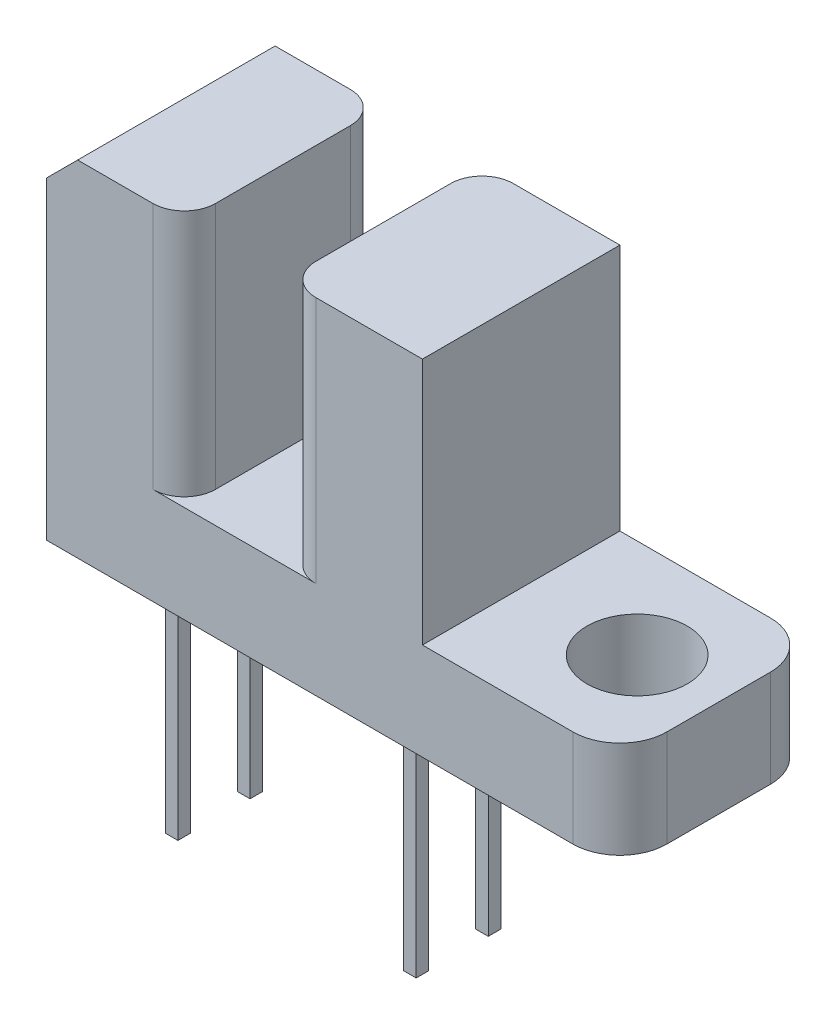
ISO-10303-21;
HEADER;
FILE_DESCRIPTION(('STEP AP214'),'2;1');
FILE_NAME('part.step','',(''),(''),'','','');
FILE_SCHEMA(('AUTOMOTIVE_DESIGN { 1 0 10303 214 1 1 1 1 }'));
ENDSEC;
DATA;
#1=APPLICATION_CONTEXT('core data for automotive mechanical design processes');
#2=APPLICATION_PROTOCOL_DEFINITION('international standard','automotive_design',2000,#1);
#3=PRODUCT_CONTEXT('',#1,'mechanical');
#4=PRODUCT('Part','Part','',(#3));
#5=PRODUCT_RELATED_PRODUCT_CATEGORY('part','',(#4));
#6=PRODUCT_DEFINITION_FORMATION('','',#4);
#7=PRODUCT_DEFINITION_CONTEXT('part definition',#1,'design');
#8=PRODUCT_DEFINITION('design','',#6,#7);
#9=PRODUCT_DEFINITION_SHAPE('','',#8);
#10=(LENGTH_UNIT() NAMED_UNIT(*) SI_UNIT(.MILLI.,.METRE.));
#11=(NAMED_UNIT(*) PLANE_ANGLE_UNIT() SI_UNIT($,.RADIAN.));
#12=(NAMED_UNIT(*) SI_UNIT($,.STERADIAN.) SOLID_ANGLE_UNIT());
#13=UNCERTAINTY_MEASURE_WITH_UNIT(LENGTH_MEASURE(1.E-05),#10,'distance_accuracy_value','');
#14=(GEOMETRIC_REPRESENTATION_CONTEXT(3) GLOBAL_UNCERTAINTY_ASSIGNED_CONTEXT((#13)) GLOBAL_UNIT_ASSIGNED_CONTEXT((#10,
#11,#12)) REPRESENTATION_CONTEXT('',''));
#15=CARTESIAN_POINT('',(0.,0.,0.));
#16=DIRECTION('',(0.,0.,1.));
#17=DIRECTION('',(1.,0.,0.));
#18=AXIS2_PLACEMENT_3D('',#15,#16,#17);
#19=CARTESIAN_POINT('',(0.,0.,0.));
#20=DIRECTION('',(0.,1.,0.));
#21=DIRECTION('',(0.,0.,1.));
#22=AXIS2_PLACEMENT_3D('',#19,#20,#21);
#23=PLANE('',#22);
#24=DIRECTION('',(0.,0.,1.));
#25=VECTOR('',#24,1.);
#26=CARTESIAN_POINT('',(-6.75,0.,1.35));
#27=LINE('',#26,#25);
#28=CARTESIAN_POINT('',(-6.75,0.,0.95));
#29=VERTEX_POINT('',#28);
#30=CARTESIAN_POINT('',(-6.75,0.,1.35));
#31=VERTEX_POINT('',#30);
#32=EDGE_CURVE('E279',#29,#31,#27,.T.);
#33=ORIENTED_EDGE('',*,*,#32,.F.);
#34=DIRECTION('',(1.,0.,0.));
#35=VECTOR('',#34,1.);
#36=CARTESIAN_POINT('',(-7.15,0.,0.95));
#37=LINE('',#36,#35);
#38=CARTESIAN_POINT('',(-7.15,0.,0.95));
#39=VERTEX_POINT('',#38);
#40=EDGE_CURVE('E295',#39,#29,#37,.T.);
#41=ORIENTED_EDGE('',*,*,#40,.F.);
#42=DIRECTION('',(0.,0.,-1.));
#43=VECTOR('',#42,1.);
#44=CARTESIAN_POINT('',(-7.15,0.,1.35));
#45=LINE('',#44,#43);
#46=CARTESIAN_POINT('',(-7.15,0.,1.35));
#47=VERTEX_POINT('',#46);
#48=EDGE_CURVE('E308',#47,#39,#45,.T.);
#49=ORIENTED_EDGE('',*,*,#48,.F.);
#50=DIRECTION('',(-1.,0.,0.));
#51=VECTOR('',#50,1.);
#52=CARTESIAN_POINT('',(-7.15,0.,1.35));
#53=LINE('',#52,#51);
#54=EDGE_CURVE('E284',#31,#47,#53,.T.);
#55=ORIENTED_EDGE('',*,*,#54,.F.);
#56=EDGE_LOOP('',(#33,#41,#49,#55));
#57=FACE_BOUND('',#56,.T.);
#58=DIRECTION('',(0.,0.,1.));
#59=VECTOR('',#58,1.);
#60=CARTESIAN_POINT('',(0.85,0.,1.35));
#61=LINE('',#60,#59);
#62=CARTESIAN_POINT('',(0.85,0.,0.95));
#63=VERTEX_POINT('',#62);
#64=CARTESIAN_POINT('',(0.85,0.,1.35));
#65=VERTEX_POINT('',#64);
#66=EDGE_CURVE('E375',#63,#65,#61,.T.);
#67=ORIENTED_EDGE('',*,*,#66,.F.);
#68=DIRECTION('',(1.,0.,0.));
#69=VECTOR('',#68,1.);
#70=CARTESIAN_POINT('',(0.450000000000001,0.,0.95));
#71=LINE('',#70,#69);
#72=CARTESIAN_POINT('',(0.450000000000001,0.,0.95));
#73=VERTEX_POINT('',#72);
#74=EDGE_CURVE('E381',#73,#63,#71,.T.);
#75=ORIENTED_EDGE('',*,*,#74,.F.);
#76=DIRECTION('',(0.,0.,-1.));
#77=VECTOR('',#76,1.);
#78=CARTESIAN_POINT('',(0.45,0.,1.35));
#79=LINE('',#78,#77);
#80=CARTESIAN_POINT('',(0.45,0.,1.35));
#81=VERTEX_POINT('',#80);
#82=EDGE_CURVE('E398',#81,#73,#79,.T.);
#83=ORIENTED_EDGE('',*,*,#82,.F.);
#84=DIRECTION('',(-1.,0.,0.));
#85=VECTOR('',#84,1.);
#86=CARTESIAN_POINT('',(0.45,0.,1.35));
#87=LINE('',#86,#85);
#88=EDGE_CURVE('E394',#65,#81,#87,.T.);
#89=ORIENTED_EDGE('',*,*,#88,.F.);
#90=EDGE_LOOP('',(#67,#75,#83,#89));
#91=FACE_BOUND('',#90,.T.);
#92=CARTESIAN_POINT('',(6.55,0.,0.));
#93=DIRECTION('',(0.,1.,0.));
#94=DIRECTION('',(0.,0.,1.));
#95=AXIS2_PLACEMENT_3D('',#92,#93,#94);
#96=CIRCLE('',#95,1.6);
#97=CARTESIAN_POINT('',(6.55,0.,1.6));
#98=VERTEX_POINT('',#97);
#99=EDGE_CURVE('E446',#98,#98,#96,.T.);
#100=ORIENTED_EDGE('',*,*,#99,.T.);
#101=EDGE_LOOP('',(#100));
#102=FACE_BOUND('',#101,.T.);
#103=DIRECTION('',(-1.,0.,0.));
#104=VECTOR('',#103,1.);
#105=CARTESIAN_POINT('',(-9.15,0.,-3.15));
#106=LINE('',#105,#104);
#107=CARTESIAN_POINT('',(7.65,0.,-3.15));
#108=VERTEX_POINT('',#107);
#109=CARTESIAN_POINT('',(-9.15,0.,-3.15));
#110=VERTEX_POINT('',#109);
#111=EDGE_CURVE('E491',#108,#110,#106,.T.);
#112=ORIENTED_EDGE('',*,*,#111,.F.);
#113=CARTESIAN_POINT('',(7.65,0.,-1.65));
#114=DIRECTION('',(0.,1.,0.));
#115=DIRECTION('',(0.,0.,1.));
#116=AXIS2_PLACEMENT_3D('',#113,#114,#115);
#117=CIRCLE('',#116,1.5);
#118=CARTESIAN_POINT('',(9.15,0.,-1.65));
#119=VERTEX_POINT('',#118);
#120=EDGE_CURVE('E514',#108,#119,#117,.F.);
#121=ORIENTED_EDGE('',*,*,#120,.T.);
#122=DIRECTION('',(0.,0.,-1.));
#123=VECTOR('',#122,1.);
#124=CARTESIAN_POINT('',(9.15,0.,-3.15));
#125=LINE('',#124,#123);
#126=CARTESIAN_POINT('',(9.15,0.,1.65));
#127=VERTEX_POINT('',#126);
#128=EDGE_CURVE('E475',#127,#119,#125,.T.);
#129=ORIENTED_EDGE('',*,*,#128,.F.);
#130=CARTESIAN_POINT('',(7.65,0.,1.65));
#131=DIRECTION('',(0.,1.,0.));
#132=DIRECTION('',(0.,0.,1.));
#133=AXIS2_PLACEMENT_3D('',#130,#131,#132);
#134=CIRCLE('',#133,1.5);
#135=CARTESIAN_POINT('',(7.65,0.,3.15));
#136=VERTEX_POINT('',#135);
#137=EDGE_CURVE('E511',#127,#136,#134,.F.);
#138=ORIENTED_EDGE('',*,*,#137,.T.);
#139=DIRECTION('',(1.,0.,0.));
#140=VECTOR('',#139,1.);
#141=CARTESIAN_POINT('',(-9.15,0.,3.15));
#142=LINE('',#141,#140);
#143=CARTESIAN_POINT('',(-9.15,0.,3.15));
#144=VERTEX_POINT('',#143);
#145=EDGE_CURVE('E481',#144,#136,#142,.T.);
#146=ORIENTED_EDGE('',*,*,#145,.F.);
#147=DIRECTION('',(0.,0.,1.));
#148=VECTOR('',#147,1.);
#149=CARTESIAN_POINT('',(-9.15,0.,-3.15));
#150=LINE('',#149,#148);
#151=EDGE_CURVE('E495',#110,#144,#150,.T.);
#152=ORIENTED_EDGE('',*,*,#151,.F.);
#153=EDGE_LOOP('',(#112,#121,#129,#138,#146,#152));
#154=FACE_BOUND('',#153,.T.);
#155=DIRECTION('',(0.,0.,1.));
#156=VECTOR('',#155,1.);
#157=CARTESIAN_POINT('',(0.85,0.,-0.95));
#158=LINE('',#157,#156);
#159=CARTESIAN_POINT('',(0.85,0.,-1.35));
#160=VERTEX_POINT('',#159);
#161=CARTESIAN_POINT('',(0.85,0.,-0.95));
#162=VERTEX_POINT('',#161);
#163=EDGE_CURVE('E330',#160,#162,#158,.T.);
#164=ORIENTED_EDGE('',*,*,#163,.F.);
#165=DIRECTION('',(1.,0.,0.));
#166=VECTOR('',#165,1.);
#167=CARTESIAN_POINT('',(0.45,0.,-1.35));
#168=LINE('',#167,#166);
#169=CARTESIAN_POINT('',(0.45,0.,-1.35));
#170=VERTEX_POINT('',#169);
#171=EDGE_CURVE('E336',#170,#160,#168,.T.);
#172=ORIENTED_EDGE('',*,*,#171,.F.);
#173=DIRECTION('',(0.,0.,-1.));
#174=VECTOR('',#173,1.);
#175=CARTESIAN_POINT('',(0.45,0.,-0.95));
#176=LINE('',#175,#174);
#177=CARTESIAN_POINT('',(0.45,0.,-0.95));
#178=VERTEX_POINT('',#177);
#179=EDGE_CURVE('E353',#178,#170,#176,.T.);
#180=ORIENTED_EDGE('',*,*,#179,.F.);
#181=DIRECTION('',(-1.,0.,0.));
#182=VECTOR('',#181,1.);
#183=CARTESIAN_POINT('',(0.45,0.,-0.95));
#184=LINE('',#183,#182);
#185=EDGE_CURVE('E349',#162,#178,#184,.T.);
#186=ORIENTED_EDGE('',*,*,#185,.F.);
#187=EDGE_LOOP('',(#164,#172,#180,#186));
#188=FACE_BOUND('',#187,.T.);
#189=DIRECTION('',(0.,0.,1.));
#190=VECTOR('',#189,1.);
#191=CARTESIAN_POINT('',(-6.75,0.,-0.95));
#192=LINE('',#191,#190);
#193=CARTESIAN_POINT('',(-6.75,0.,-1.35));
#194=VERTEX_POINT('',#193);
#195=CARTESIAN_POINT('',(-6.75,0.,-0.95));
#196=VERTEX_POINT('',#195);
#197=EDGE_CURVE('E277',#194,#196,#192,.T.);
#198=ORIENTED_EDGE('',*,*,#197,.F.);
#199=DIRECTION('',(1.,0.,0.));
#200=VECTOR('',#199,1.);
#201=CARTESIAN_POINT('',(-7.15,0.,-1.35));
#202=LINE('',#201,#200);
#203=CARTESIAN_POINT('',(-7.15,0.,-1.35));
#204=VERTEX_POINT('',#203);
#205=EDGE_CURVE('E274',#204,#194,#202,.T.);
#206=ORIENTED_EDGE('',*,*,#205,.F.);
#207=DIRECTION('',(0.,0.,-1.));
#208=VECTOR('',#207,1.);
#209=CARTESIAN_POINT('',(-7.15,0.,-0.95));
#210=LINE('',#209,#208);
#211=CARTESIAN_POINT('',(-7.15,0.,-0.95));
#212=VERTEX_POINT('',#211);
#213=EDGE_CURVE('E61',#212,#204,#210,.T.);
#214=ORIENTED_EDGE('',*,*,#213,.F.);
#215=DIRECTION('',(-1.,0.,0.));
#216=VECTOR('',#215,1.);
#217=CARTESIAN_POINT('',(-7.15,0.,-0.95));
#218=LINE('',#217,#216);
#219=EDGE_CURVE('E56',#196,#212,#218,.T.);
#220=ORIENTED_EDGE('',*,*,#219,.F.);
#221=EDGE_LOOP('',(#198,#206,#214,#220));
#222=FACE_BOUND('',#221,.T.);
#223=ADVANCED_FACE('F40',(#57,#91,#102,#154,#188,#222),#23,.F.);
#224=CARTESIAN_POINT('',(0.,11.,0.));
#225=DIRECTION('',(0.,-1.,0.));
#226=DIRECTION('',(0.,0.,-1.));
#227=AXIS2_PLACEMENT_3D('',#224,#225,#226);
#228=PLANE('',#227);
#229=DIRECTION('',(1.,0.,0.));
#230=VECTOR('',#229,1.);
#231=CARTESIAN_POINT('',(-9.15,11.,3.15));
#232=LINE('',#231,#230);
#233=CARTESIAN_POINT('',(-8.15,11.,3.15));
#234=VERTEX_POINT('',#233);
#235=CARTESIAN_POINT('',(-5.75,11.,3.15));
#236=VERTEX_POINT('',#235);
#237=EDGE_CURVE('E451',#234,#236,#232,.T.);
#238=ORIENTED_EDGE('',*,*,#237,.T.);
#239=CARTESIAN_POINT('',(-5.75,11.,2.15));
#240=DIRECTION('',(0.,-1.,0.));
#241=DIRECTION('',(0.,0.,-1.));
#242=AXIS2_PLACEMENT_3D('',#239,#240,#241);
#243=CIRCLE('',#242,1.);
#244=CARTESIAN_POINT('',(-4.75,11.,2.15));
#245=VERTEX_POINT('',#244);
#246=EDGE_CURVE('E586',#236,#245,#243,.F.);
#247=ORIENTED_EDGE('',*,*,#246,.T.);
#248=DIRECTION('',(0.,0.,1.));
#249=VECTOR('',#248,1.);
#250=CARTESIAN_POINT('',(-4.75,11.,-3.15));
#251=LINE('',#250,#249);
#252=CARTESIAN_POINT('',(-4.75,11.,-2.15));
#253=VERTEX_POINT('',#252);
#254=EDGE_CURVE('E427',#253,#245,#251,.T.);
#255=ORIENTED_EDGE('',*,*,#254,.F.);
#256=CARTESIAN_POINT('',(-5.75,11.,-2.15));
#257=DIRECTION('',(0.,-1.,0.));
#258=DIRECTION('',(0.,0.,-1.));
#259=AXIS2_PLACEMENT_3D('',#256,#257,#258);
#260=CIRCLE('',#259,1.);
#261=CARTESIAN_POINT('',(-5.75,11.,-3.15));
#262=VERTEX_POINT('',#261);
#263=EDGE_CURVE('E583',#253,#262,#260,.F.);
#264=ORIENTED_EDGE('',*,*,#263,.T.);
#265=DIRECTION('',(-1.,0.,0.));
#266=VECTOR('',#265,1.);
#267=CARTESIAN_POINT('',(-9.15,11.,-3.15));
#268=LINE('',#267,#266);
#269=CARTESIAN_POINT('',(-8.15,11.,-3.15));
#270=VERTEX_POINT('',#269);
#271=EDGE_CURVE('E459',#262,#270,#268,.T.);
#272=ORIENTED_EDGE('',*,*,#271,.T.);
#273=DIRECTION('',(0.,0.,1.));
#274=VECTOR('',#273,1.);
#275=CARTESIAN_POINT('',(-8.15,11.,0.));
#276=LINE('',#275,#274);
#277=EDGE_CURVE('E534',#270,#234,#276,.T.);
#278=ORIENTED_EDGE('',*,*,#277,.T.);
#279=EDGE_LOOP('',(#238,#247,#255,#264,#272,#278));
#280=FACE_BOUND('',#279,.T.);
#281=ADVANCED_FACE('F610',(#280),#228,.F.);
#282=CARTESIAN_POINT('',(9.15,3.1,-3.15));
#283=DIRECTION('',(-1.,0.,0.));
#284=DIRECTION('',(0.,0.,1.));
#285=AXIS2_PLACEMENT_3D('',#282,#283,#284);
#286=PLANE('',#285);
#287=ORIENTED_EDGE('',*,*,#128,.T.);
#288=DIRECTION('',(0.,-1.,0.));
#289=VECTOR('',#288,1.);
#290=CARTESIAN_POINT('',(9.15,3.1,-1.65));
#291=LINE('',#290,#289);
#292=CARTESIAN_POINT('',(9.15,3.1,-1.65));
#293=VERTEX_POINT('',#292);
#294=EDGE_CURVE('E521',#119,#293,#291,.F.);
#295=ORIENTED_EDGE('',*,*,#294,.T.);
#296=DIRECTION('',(0.,0.,-1.));
#297=VECTOR('',#296,1.);
#298=CARTESIAN_POINT('',(9.15,3.1,-3.15));
#299=LINE('',#298,#297);
#300=CARTESIAN_POINT('',(9.15,3.1,1.65));
#301=VERTEX_POINT('',#300);
#302=EDGE_CURVE('E476',#301,#293,#299,.T.);
#303=ORIENTED_EDGE('',*,*,#302,.F.);
#304=DIRECTION('',(0.,-1.,0.));
#305=VECTOR('',#304,1.);
#306=CARTESIAN_POINT('',(9.15,3.1,1.65));
#307=LINE('',#306,#305);
#308=EDGE_CURVE('E517',#301,#127,#307,.T.);
#309=ORIENTED_EDGE('',*,*,#308,.T.);
#310=EDGE_LOOP('',(#287,#295,#303,#309));
#311=FACE_BOUND('',#310,.T.);
#312=ADVANCED_FACE('F639',(#311),#286,.F.);
#313=CARTESIAN_POINT('',(-9.15,3.1,-3.15));
#314=DIRECTION('',(0.,0.,1.));
#315=DIRECTION('',(1.,0.,0.));
#316=AXIS2_PLACEMENT_3D('',#313,#314,#315);
#317=PLANE('',#316);
#318=DIRECTION('',(1.,0.,0.));
#319=VECTOR('',#318,1.);
#320=CARTESIAN_POINT('',(-4.75,3.1,-3.15));
#321=LINE('',#320,#319);
#322=CARTESIAN_POINT('',(-5.75,3.1,-3.15));
#323=VERTEX_POINT('',#322);
#324=CARTESIAN_POINT('',(-0.55,3.1,-3.15));
#325=VERTEX_POINT('',#324);
#326=EDGE_CURVE('E421',#323,#325,#321,.T.);
#327=ORIENTED_EDGE('',*,*,#326,.T.);
#328=DIRECTION('',(0.,1.,0.));
#329=VECTOR('',#328,1.);
#330=CARTESIAN_POINT('',(-0.549999999999998,3.1,-3.15));
#331=LINE('',#330,#329);
#332=CARTESIAN_POINT('',(-0.550000000000002,11.,-3.15));
#333=VERTEX_POINT('',#332);
#334=EDGE_CURVE('E552',#325,#333,#331,.T.);
#335=ORIENTED_EDGE('',*,*,#334,.T.);
#336=CARTESIAN_POINT('',(2.85,11.,-3.15));
#337=VERTEX_POINT('',#336);
#338=EDGE_CURVE('E460',#337,#333,#268,.T.);
#339=ORIENTED_EDGE('',*,*,#338,.F.);
#340=DIRECTION('',(0.,-1.,0.));
#341=VECTOR('',#340,1.);
#342=CARTESIAN_POINT('',(2.85,11.,-3.15));
#343=LINE('',#342,#341);
#344=CARTESIAN_POINT('',(2.85,3.1,-3.15));
#345=VERTEX_POINT('',#344);
#346=EDGE_CURVE('E464',#337,#345,#343,.T.);
#347=ORIENTED_EDGE('',*,*,#346,.T.);
#348=DIRECTION('',(-1.,0.,0.));
#349=VECTOR('',#348,1.);
#350=CARTESIAN_POINT('',(-9.15,3.1,-3.15));
#351=LINE('',#350,#349);
#352=CARTESIAN_POINT('',(7.65,3.1,-3.15));
#353=VERTEX_POINT('',#352);
#354=EDGE_CURVE('E480',#353,#345,#351,.T.);
#355=ORIENTED_EDGE('',*,*,#354,.F.);
#356=DIRECTION('',(0.,-1.,0.));
#357=VECTOR('',#356,1.);
#358=CARTESIAN_POINT('',(7.65,3.1,-3.15));
#359=LINE('',#358,#357);
#360=EDGE_CURVE('E507',#353,#108,#359,.T.);
#361=ORIENTED_EDGE('',*,*,#360,.T.);
#362=ORIENTED_EDGE('',*,*,#111,.T.);
#363=DIRECTION('',(0.,-1.,0.));
#364=VECTOR('',#363,1.);
#365=CARTESIAN_POINT('',(-9.15,3.1,-3.15));
#366=LINE('',#365,#364);
#367=CARTESIAN_POINT('',(-9.15,9.99999999999999,-3.15));
#368=VERTEX_POINT('',#367);
#369=EDGE_CURVE('E504',#368,#110,#366,.T.);
#370=ORIENTED_EDGE('',*,*,#369,.F.);
#371=DIRECTION('',(-0.707106781186547,-0.707106781186548,0.));
#372=VECTOR('',#371,1.);
#373=CARTESIAN_POINT('',(-8.15,11.,-3.15));
#374=LINE('',#373,#372);
#375=EDGE_CURVE('E544',#368,#270,#374,.F.);
#376=ORIENTED_EDGE('',*,*,#375,.T.);
#377=ORIENTED_EDGE('',*,*,#271,.F.);
#378=DIRECTION('',(0.,-1.,0.));
#379=VECTOR('',#378,1.);
#380=CARTESIAN_POINT('',(-5.75,3.1,-3.15));
#381=LINE('',#380,#379);
#382=EDGE_CURVE('E548',#262,#323,#381,.T.);
#383=ORIENTED_EDGE('',*,*,#382,.T.);
#384=EDGE_LOOP('',(#327,#335,#339,#347,#355,#361,#362,#370,#376,#377,#383));
#385=FACE_BOUND('',#384,.T.);
#386=ADVANCED_FACE('F646',(#385),#317,.F.);
#387=CARTESIAN_POINT('',(-9.15,3.1,-3.15));
#388=DIRECTION('',(1.,0.,0.));
#389=DIRECTION('',(0.,0.,-1.));
#390=AXIS2_PLACEMENT_3D('',#387,#388,#389);
#391=PLANE('',#390);
#392=DIRECTION('',(0.,-1.,0.));
#393=VECTOR('',#392,1.);
#394=CARTESIAN_POINT('',(-9.15,3.1,3.15));
#395=LINE('',#394,#393);
#396=CARTESIAN_POINT('',(-9.15,9.99999999999999,3.15));
#397=VERTEX_POINT('',#396);
#398=EDGE_CURVE('E487',#397,#144,#395,.T.);
#399=ORIENTED_EDGE('',*,*,#398,.F.);
#400=DIRECTION('',(0.,0.,-1.));
#401=VECTOR('',#400,1.);
#402=CARTESIAN_POINT('',(-9.15,10.,-3.15));
#403=LINE('',#402,#401);
#404=EDGE_CURVE('E541',#397,#368,#403,.T.);
#405=ORIENTED_EDGE('',*,*,#404,.T.);
#406=ORIENTED_EDGE('',*,*,#369,.T.);
#407=ORIENTED_EDGE('',*,*,#151,.T.);
#408=EDGE_LOOP('',(#399,#405,#406,#407));
#409=FACE_BOUND('',#408,.T.);
#410=ADVANCED_FACE('F620',(#409),#391,.F.);
#411=CARTESIAN_POINT('',(-9.15,3.1,3.15));
#412=DIRECTION('',(0.,0.,-1.));
#413=DIRECTION('',(-1.,0.,0.));
#414=AXIS2_PLACEMENT_3D('',#411,#412,#413);
#415=PLANE('',#414);
#416=CARTESIAN_POINT('',(-0.550000000000002,11.,3.15));
#417=VERTEX_POINT('',#416);
#418=CARTESIAN_POINT('',(2.85,11.,3.15));
#419=VERTEX_POINT('',#418);
#420=EDGE_CURVE('E456',#417,#419,#232,.T.);
#421=ORIENTED_EDGE('',*,*,#420,.F.);
#422=DIRECTION('',(0.,1.,0.));
#423=VECTOR('',#422,1.);
#424=CARTESIAN_POINT('',(-0.55,3.1,3.15));
#425=LINE('',#424,#423);
#426=CARTESIAN_POINT('',(-0.55,3.1,3.15));
#427=VERTEX_POINT('',#426);
#428=EDGE_CURVE('E572',#417,#427,#425,.F.);
#429=ORIENTED_EDGE('',*,*,#428,.T.);
#430=DIRECTION('',(1.,0.,0.));
#431=VECTOR('',#430,1.);
#432=CARTESIAN_POINT('',(-4.75,3.1,3.15));
#433=LINE('',#432,#431);
#434=CARTESIAN_POINT('',(-5.75,3.1,3.15));
#435=VERTEX_POINT('',#434);
#436=EDGE_CURVE('E420',#435,#427,#433,.T.);
#437=ORIENTED_EDGE('',*,*,#436,.F.);
#438=DIRECTION('',(0.,-1.,0.));
#439=VECTOR('',#438,1.);
#440=CARTESIAN_POINT('',(-5.75,3.1,3.15));
#441=LINE('',#440,#439);
#442=EDGE_CURVE('E569',#435,#236,#441,.F.);
#443=ORIENTED_EDGE('',*,*,#442,.T.);
#444=ORIENTED_EDGE('',*,*,#237,.F.);
#445=DIRECTION('',(0.707106781186547,0.707106781186548,0.));
#446=VECTOR('',#445,1.);
#447=CARTESIAN_POINT('',(-8.15,11.,3.15));
#448=LINE('',#447,#446);
#449=EDGE_CURVE('E538',#234,#397,#448,.F.);
#450=ORIENTED_EDGE('',*,*,#449,.T.);
#451=ORIENTED_EDGE('',*,*,#398,.T.);
#452=ORIENTED_EDGE('',*,*,#145,.T.);
#453=DIRECTION('',(0.,-1.,0.));
#454=VECTOR('',#453,1.);
#455=CARTESIAN_POINT('',(7.65,3.1,3.15));
#456=LINE('',#455,#454);
#457=CARTESIAN_POINT('',(7.65,3.1,3.15));
#458=VERTEX_POINT('',#457);
#459=EDGE_CURVE('E530',#136,#458,#456,.F.);
#460=ORIENTED_EDGE('',*,*,#459,.T.);
#461=DIRECTION('',(1.,0.,0.));
#462=VECTOR('',#461,1.);
#463=CARTESIAN_POINT('',(-9.15,3.1,3.15));
#464=LINE('',#463,#462);
#465=CARTESIAN_POINT('',(2.85,3.1,3.15));
#466=VERTEX_POINT('',#465);
#467=EDGE_CURVE('E484',#466,#458,#464,.T.);
#468=ORIENTED_EDGE('',*,*,#467,.F.);
#469=DIRECTION('',(0.,-1.,0.));
#470=VECTOR('',#469,1.);
#471=CARTESIAN_POINT('',(2.85,11.,3.15));
#472=LINE('',#471,#470);
#473=EDGE_CURVE('E471',#419,#466,#472,.T.);
#474=ORIENTED_EDGE('',*,*,#473,.F.);
#475=EDGE_LOOP('',(#421,#429,#437,#443,#444,#450,#451,#452,#460,#468,#474));
#476=FACE_BOUND('',#475,.T.);
#477=ADVANCED_FACE('F608',(#476),#415,.F.);
#478=CARTESIAN_POINT('',(0.,3.1,0.));
#479=DIRECTION('',(0.,1.,0.));
#480=DIRECTION('',(0.,0.,1.));
#481=AXIS2_PLACEMENT_3D('',#478,#479,#480);
#482=PLANE('',#481);
#483=CARTESIAN_POINT('',(6.55,3.1,0.));
#484=DIRECTION('',(0.,1.,0.));
#485=DIRECTION('',(0.,0.,1.));
#486=AXIS2_PLACEMENT_3D('',#483,#484,#485);
#487=CIRCLE('',#486,1.6);
#488=CARTESIAN_POINT('',(6.55,3.1,1.6));
#489=VERTEX_POINT('',#488);
#490=EDGE_CURVE('E431',#489,#489,#487,.T.);
#491=ORIENTED_EDGE('',*,*,#490,.F.);
#492=EDGE_LOOP('',(#491));
#493=FACE_BOUND('',#492,.T.);
#494=DIRECTION('',(0.,0.,-1.));
#495=VECTOR('',#494,1.);
#496=CARTESIAN_POINT('',(2.85,3.1,3.15));
#497=LINE('',#496,#495);
#498=EDGE_CURVE('E450',#466,#345,#497,.T.);
#499=ORIENTED_EDGE('',*,*,#498,.F.);
#500=ORIENTED_EDGE('',*,*,#467,.T.);
#501=CARTESIAN_POINT('',(7.65,3.1,1.65));
#502=DIRECTION('',(0.,1.,0.));
#503=DIRECTION('',(0.,0.,1.));
#504=AXIS2_PLACEMENT_3D('',#501,#502,#503);
#505=CIRCLE('',#504,1.5);
#506=EDGE_CURVE('E524',#458,#301,#505,.T.);
#507=ORIENTED_EDGE('',*,*,#506,.T.);
#508=ORIENTED_EDGE('',*,*,#302,.T.);
#509=CARTESIAN_POINT('',(7.65,3.1,-1.65));
#510=DIRECTION('',(0.,1.,0.));
#511=DIRECTION('',(0.,0.,1.));
#512=AXIS2_PLACEMENT_3D('',#509,#510,#511);
#513=CIRCLE('',#512,1.5);
#514=EDGE_CURVE('E527',#293,#353,#513,.T.);
#515=ORIENTED_EDGE('',*,*,#514,.T.);
#516=ORIENTED_EDGE('',*,*,#354,.T.);
#517=EDGE_LOOP('',(#499,#500,#507,#508,#515,#516));
#518=FACE_BOUND('',#517,.T.);
#519=ADVANCED_FACE('F636',(#493,#518),#482,.T.);
#520=CARTESIAN_POINT('',(7.65,3.1,-1.65));
#521=DIRECTION('',(0.,-1.,0.));
#522=DIRECTION('',(0.,0.,-1.));
#523=AXIS2_PLACEMENT_3D('',#520,#521,#522);
#524=CYLINDRICAL_SURFACE('',#523,1.5);
#525=ORIENTED_EDGE('',*,*,#514,.F.);
#526=ORIENTED_EDGE('',*,*,#294,.F.);
#527=ORIENTED_EDGE('',*,*,#120,.F.);
#528=ORIENTED_EDGE('',*,*,#360,.F.);
#529=EDGE_LOOP('',(#525,#526,#527,#528));
#530=FACE_BOUND('',#529,.T.);
#531=ADVANCED_FACE('F642',(#530),#524,.T.);
#532=CARTESIAN_POINT('',(7.65,3.1,1.65));
#533=DIRECTION('',(0.,-1.,0.));
#534=DIRECTION('',(0.,0.,-1.));
#535=AXIS2_PLACEMENT_3D('',#532,#533,#534);
#536=CYLINDRICAL_SURFACE('',#535,1.5);
#537=ORIENTED_EDGE('',*,*,#506,.F.);
#538=ORIENTED_EDGE('',*,*,#459,.F.);
#539=ORIENTED_EDGE('',*,*,#137,.F.);
#540=ORIENTED_EDGE('',*,*,#308,.F.);
#541=EDGE_LOOP('',(#537,#538,#539,#540));
#542=FACE_BOUND('',#541,.T.);
#543=ADVANCED_FACE('F632',(#542),#536,.T.);
#544=CARTESIAN_POINT('',(2.85,11.,3.15));
#545=DIRECTION('',(-1.,0.,0.));
#546=DIRECTION('',(0.,0.,1.));
#547=AXIS2_PLACEMENT_3D('',#544,#545,#546);
#548=PLANE('',#547);
#549=ORIENTED_EDGE('',*,*,#498,.T.);
#550=ORIENTED_EDGE('',*,*,#346,.F.);
#551=DIRECTION('',(0.,0.,-1.));
#552=VECTOR('',#551,1.);
#553=CARTESIAN_POINT('',(2.85,11.,3.15));
#554=LINE('',#553,#552);
#555=EDGE_CURVE('E455',#419,#337,#554,.T.);
#556=ORIENTED_EDGE('',*,*,#555,.F.);
#557=ORIENTED_EDGE('',*,*,#473,.T.);
#558=EDGE_LOOP('',(#549,#550,#556,#557));
#559=FACE_BOUND('',#558,.T.);
#560=ADVANCED_FACE('F651',(#559),#548,.F.);
#561=ORIENTED_EDGE('',*,*,#338,.T.);
#562=CARTESIAN_POINT('',(-0.550000000000001,11.,-2.15));
#563=DIRECTION('',(0.,-1.,0.));
#564=DIRECTION('',(0.,0.,-1.));
#565=AXIS2_PLACEMENT_3D('',#562,#563,#564);
#566=CIRCLE('',#565,1.);
#567=CARTESIAN_POINT('',(-1.55,11.,-2.15));
#568=VERTEX_POINT('',#567);
#569=EDGE_CURVE('E559',#333,#568,#566,.F.);
#570=ORIENTED_EDGE('',*,*,#569,.T.);
#571=DIRECTION('',(0.,0.,1.));
#572=VECTOR('',#571,1.);
#573=CARTESIAN_POINT('',(-1.55,11.,-3.15));
#574=LINE('',#573,#572);
#575=CARTESIAN_POINT('',(-1.55,11.,2.15));
#576=VERTEX_POINT('',#575);
#577=EDGE_CURVE('E432',#568,#576,#574,.T.);
#578=ORIENTED_EDGE('',*,*,#577,.T.);
#579=CARTESIAN_POINT('',(-0.550000000000001,11.,2.15));
#580=DIRECTION('',(0.,-1.,0.));
#581=DIRECTION('',(0.,0.,-1.));
#582=AXIS2_PLACEMENT_3D('',#579,#580,#581);
#583=CIRCLE('',#582,1.);
#584=EDGE_CURVE('E556',#576,#417,#583,.F.);
#585=ORIENTED_EDGE('',*,*,#584,.T.);
#586=ORIENTED_EDGE('',*,*,#420,.T.);
#587=ORIENTED_EDGE('',*,*,#555,.T.);
#588=EDGE_LOOP('',(#561,#570,#578,#585,#586,#587));
#589=FACE_BOUND('',#588,.T.);
#590=ADVANCED_FACE('F685',(#589),#228,.F.);
#591=CARTESIAN_POINT('',(6.55,3.1,0.));
#592=DIRECTION('',(0.,1.,0.));
#593=DIRECTION('',(0.,0.,1.));
#594=AXIS2_PLACEMENT_3D('',#591,#592,#593);
#595=CYLINDRICAL_SURFACE('',#594,1.6);
#596=ORIENTED_EDGE('',*,*,#99,.F.);
#597=EDGE_LOOP('',(#596));
#598=FACE_BOUND('',#597,.T.);
#599=ORIENTED_EDGE('',*,*,#490,.T.);
#600=EDGE_LOOP('',(#599));
#601=FACE_BOUND('',#600,.T.);
#602=ADVANCED_FACE('F678',(#598,#601),#595,.F.);
#603=CARTESIAN_POINT('',(-4.75,11.,-3.15));
#604=DIRECTION('',(-1.,0.,0.));
#605=DIRECTION('',(0.,-1.,0.));
#606=AXIS2_PLACEMENT_3D('',#603,#604,#605);
#607=PLANE('',#606);
#608=ORIENTED_EDGE('',*,*,#254,.T.);
#609=DIRECTION('',(0.,-1.,0.));
#610=VECTOR('',#609,1.);
#611=CARTESIAN_POINT('',(-4.75,11.,2.15));
#612=LINE('',#611,#610);
#613=CARTESIAN_POINT('',(-4.75,3.1,2.15));
#614=VERTEX_POINT('',#613);
#615=EDGE_CURVE('E579',#245,#614,#612,.T.);
#616=ORIENTED_EDGE('',*,*,#615,.T.);
#617=DIRECTION('',(0.,0.,1.));
#618=VECTOR('',#617,1.);
#619=CARTESIAN_POINT('',(-4.75,3.1,-3.15));
#620=LINE('',#619,#618);
#621=CARTESIAN_POINT('',(-4.75,3.1,-2.15));
#622=VERTEX_POINT('',#621);
#623=EDGE_CURVE('E424',#622,#614,#620,.T.);
#624=ORIENTED_EDGE('',*,*,#623,.F.);
#625=DIRECTION('',(0.,-1.,0.));
#626=VECTOR('',#625,1.);
#627=CARTESIAN_POINT('',(-4.75,11.,-2.15));
#628=LINE('',#627,#626);
#629=EDGE_CURVE('E576',#622,#253,#628,.F.);
#630=ORIENTED_EDGE('',*,*,#629,.T.);
#631=EDGE_LOOP('',(#608,#616,#624,#630));
#632=FACE_BOUND('',#631,.T.);
#633=ADVANCED_FACE('F676',(#632),#607,.F.);
#634=CARTESIAN_POINT('',(-1.55,11.,-3.15));
#635=DIRECTION('',(1.,0.,0.));
#636=DIRECTION('',(0.,1.,0.));
#637=AXIS2_PLACEMENT_3D('',#634,#635,#636);
#638=PLANE('',#637);
#639=ORIENTED_EDGE('',*,*,#577,.F.);
#640=DIRECTION('',(0.,1.,0.));
#641=VECTOR('',#640,1.);
#642=CARTESIAN_POINT('',(-1.55,11.,-2.15));
#643=LINE('',#642,#641);
#644=CARTESIAN_POINT('',(-1.55,3.1,-2.15));
#645=VERTEX_POINT('',#644);
#646=EDGE_CURVE('E566',#568,#645,#643,.F.);
#647=ORIENTED_EDGE('',*,*,#646,.T.);
#648=DIRECTION('',(0.,0.,1.));
#649=VECTOR('',#648,1.);
#650=CARTESIAN_POINT('',(-1.55,3.1,-3.15));
#651=LINE('',#650,#649);
#652=CARTESIAN_POINT('',(-1.55,3.1,2.15));
#653=VERTEX_POINT('',#652);
#654=EDGE_CURVE('E436',#645,#653,#651,.T.);
#655=ORIENTED_EDGE('',*,*,#654,.T.);
#656=DIRECTION('',(0.,1.,0.));
#657=VECTOR('',#656,1.);
#658=CARTESIAN_POINT('',(-1.55,11.,2.15));
#659=LINE('',#658,#657);
#660=EDGE_CURVE('E562',#653,#576,#659,.T.);
#661=ORIENTED_EDGE('',*,*,#660,.T.);
#662=EDGE_LOOP('',(#639,#647,#655,#661));
#663=FACE_BOUND('',#662,.T.);
#664=ADVANCED_FACE('F664',(#663),#638,.F.);
#665=CARTESIAN_POINT('',(-4.75,3.1,-3.15));
#666=DIRECTION('',(0.,-1.,0.));
#667=DIRECTION('',(0.,0.,-1.));
#668=AXIS2_PLACEMENT_3D('',#665,#666,#667);
#669=PLANE('',#668);
#670=ORIENTED_EDGE('',*,*,#436,.T.);
#671=CARTESIAN_POINT('',(-0.550000000000001,3.1,2.15));
#672=DIRECTION('',(0.,-1.,0.));
#673=DIRECTION('',(0.,0.,-1.));
#674=AXIS2_PLACEMENT_3D('',#671,#672,#673);
#675=CIRCLE('',#674,1.);
#676=EDGE_CURVE('E593',#427,#653,#675,.T.);
#677=ORIENTED_EDGE('',*,*,#676,.T.);
#678=ORIENTED_EDGE('',*,*,#654,.F.);
#679=CARTESIAN_POINT('',(-0.55,3.1,-2.15));
#680=DIRECTION('',(0.,-1.,0.));
#681=DIRECTION('',(0.,0.,-1.));
#682=AXIS2_PLACEMENT_3D('',#679,#680,#681);
#683=CIRCLE('',#682,1.);
#684=EDGE_CURVE('E589',#645,#325,#683,.T.);
#685=ORIENTED_EDGE('',*,*,#684,.T.);
#686=ORIENTED_EDGE('',*,*,#326,.F.);
#687=CARTESIAN_POINT('',(-5.75,3.1,-2.15));
#688=DIRECTION('',(0.,-1.,0.));
#689=DIRECTION('',(0.,0.,-1.));
#690=AXIS2_PLACEMENT_3D('',#687,#688,#689);
#691=CIRCLE('',#690,1.);
#692=EDGE_CURVE('E11',#323,#622,#691,.T.);
#693=ORIENTED_EDGE('',*,*,#692,.T.);
#694=ORIENTED_EDGE('',*,*,#623,.T.);
#695=CARTESIAN_POINT('',(-5.75,3.1,2.15));
#696=DIRECTION('',(0.,-1.,0.));
#697=DIRECTION('',(0.,0.,-1.));
#698=AXIS2_PLACEMENT_3D('',#695,#696,#697);
#699=CIRCLE('',#698,1.);
#700=EDGE_CURVE('E49',#614,#435,#699,.T.);
#701=ORIENTED_EDGE('',*,*,#700,.T.);
#702=EDGE_LOOP('',(#670,#677,#678,#685,#686,#693,#694,#701));
#703=FACE_BOUND('',#702,.T.);
#704=ADVANCED_FACE('F599',(#703),#669,.F.);
#705=CARTESIAN_POINT('',(-8.15,11.,0.));
#706=DIRECTION('',(0.707106781186548,-0.707106781186547,0.));
#707=DIRECTION('',(0.,0.,1.));
#708=AXIS2_PLACEMENT_3D('',#705,#706,#707);
#709=PLANE('',#708);
#710=ORIENTED_EDGE('',*,*,#375,.F.);
#711=ORIENTED_EDGE('',*,*,#404,.F.);
#712=ORIENTED_EDGE('',*,*,#449,.F.);
#713=ORIENTED_EDGE('',*,*,#277,.F.);
#714=EDGE_LOOP('',(#710,#711,#712,#713));
#715=FACE_BOUND('',#714,.T.);
#716=ADVANCED_FACE('F616',(#715),#709,.F.);
#717=CARTESIAN_POINT('',(-0.55,3.1,-2.15));
#718=DIRECTION('',(0.,1.,0.));
#719=DIRECTION('',(-1.,0.,0.));
#720=AXIS2_PLACEMENT_3D('',#717,#718,#719);
#721=CYLINDRICAL_SURFACE('',#720,1.);
#722=ORIENTED_EDGE('',*,*,#684,.F.);
#723=ORIENTED_EDGE('',*,*,#646,.F.);
#724=ORIENTED_EDGE('',*,*,#569,.F.);
#725=ORIENTED_EDGE('',*,*,#334,.F.);
#726=EDGE_LOOP('',(#722,#723,#724,#725));
#727=FACE_BOUND('',#726,.T.);
#728=ADVANCED_FACE('F667',(#727),#721,.T.);
#729=CARTESIAN_POINT('',(-0.550000000000001,11.,2.15));
#730=DIRECTION('',(0.,1.,0.));
#731=DIRECTION('',(-1.,0.,0.));
#732=AXIS2_PLACEMENT_3D('',#729,#730,#731);
#733=CYLINDRICAL_SURFACE('',#732,1.);
#734=ORIENTED_EDGE('',*,*,#676,.F.);
#735=ORIENTED_EDGE('',*,*,#428,.F.);
#736=ORIENTED_EDGE('',*,*,#584,.F.);
#737=ORIENTED_EDGE('',*,*,#660,.F.);
#738=EDGE_LOOP('',(#734,#735,#736,#737));
#739=FACE_BOUND('',#738,.T.);
#740=ADVANCED_FACE('F658',(#739),#733,.T.);
#741=CARTESIAN_POINT('',(-5.75,11.,2.15));
#742=DIRECTION('',(0.,-1.,0.));
#743=DIRECTION('',(1.,0.,0.));
#744=AXIS2_PLACEMENT_3D('',#741,#742,#743);
#745=CYLINDRICAL_SURFACE('',#744,1.);
#746=ORIENTED_EDGE('',*,*,#246,.F.);
#747=ORIENTED_EDGE('',*,*,#442,.F.);
#748=ORIENTED_EDGE('',*,*,#700,.F.);
#749=ORIENTED_EDGE('',*,*,#615,.F.);
#750=EDGE_LOOP('',(#746,#747,#748,#749));
#751=FACE_BOUND('',#750,.T.);
#752=ADVANCED_FACE('F604',(#751),#745,.T.);
#753=CARTESIAN_POINT('',(-5.75,3.1,-2.15));
#754=DIRECTION('',(0.,-1.,0.));
#755=DIRECTION('',(1.,0.,0.));
#756=AXIS2_PLACEMENT_3D('',#753,#754,#755);
#757=CYLINDRICAL_SURFACE('',#756,1.);
#758=ORIENTED_EDGE('',*,*,#263,.F.);
#759=ORIENTED_EDGE('',*,*,#629,.F.);
#760=ORIENTED_EDGE('',*,*,#692,.F.);
#761=ORIENTED_EDGE('',*,*,#382,.F.);
#762=EDGE_LOOP('',(#758,#759,#760,#761));
#763=FACE_BOUND('',#762,.T.);
#764=ADVANCED_FACE('F42',(#763),#757,.T.);
#765=CARTESIAN_POINT('',(0.85,-8.,1.35));
#766=DIRECTION('',(-1.,0.,0.));
#767=DIRECTION('',(0.,0.,1.));
#768=AXIS2_PLACEMENT_3D('',#765,#766,#767);
#769=PLANE('',#768);
#770=ORIENTED_EDGE('',*,*,#66,.T.);
#771=DIRECTION('',(0.,1.,0.));
#772=VECTOR('',#771,1.);
#773=CARTESIAN_POINT('',(0.85,-8.,1.35));
#774=LINE('',#773,#772);
#775=CARTESIAN_POINT('',(0.85,-8.,1.35));
#776=VERTEX_POINT('',#775);
#777=EDGE_CURVE('E416',#776,#65,#774,.T.);
#778=ORIENTED_EDGE('',*,*,#777,.F.);
#779=DIRECTION('',(0.,0.,1.));
#780=VECTOR('',#779,1.);
#781=CARTESIAN_POINT('',(0.85,-8.,1.35));
#782=LINE('',#781,#780);
#783=CARTESIAN_POINT('',(0.85,-8.,0.95));
#784=VERTEX_POINT('',#783);
#785=EDGE_CURVE('E376',#784,#776,#782,.T.);
#786=ORIENTED_EDGE('',*,*,#785,.F.);
#787=DIRECTION('',(0.,1.,0.));
#788=VECTOR('',#787,1.);
#789=CARTESIAN_POINT('',(0.85,-8.,0.95));
#790=LINE('',#789,#788);
#791=EDGE_CURVE('E390',#784,#63,#790,.T.);
#792=ORIENTED_EDGE('',*,*,#791,.T.);
#793=EDGE_LOOP('',(#770,#778,#786,#792));
#794=FACE_BOUND('',#793,.T.);
#795=ADVANCED_FACE('F724',(#794),#769,.F.);
#796=CARTESIAN_POINT('',(0.45,-8.,1.35));
#797=DIRECTION('',(0.,0.,-1.));
#798=DIRECTION('',(-1.,0.,0.));
#799=AXIS2_PLACEMENT_3D('',#796,#797,#798);
#800=PLANE('',#799);
#801=ORIENTED_EDGE('',*,*,#88,.T.);
#802=DIRECTION('',(0.,1.,0.));
#803=VECTOR('',#802,1.);
#804=CARTESIAN_POINT('',(0.45,-8.,1.35));
#805=LINE('',#804,#803);
#806=CARTESIAN_POINT('',(0.45,-8.,1.35));
#807=VERTEX_POINT('',#806);
#808=EDGE_CURVE('E412',#807,#81,#805,.T.);
#809=ORIENTED_EDGE('',*,*,#808,.F.);
#810=DIRECTION('',(-1.,0.,0.));
#811=VECTOR('',#810,1.);
#812=CARTESIAN_POINT('',(0.45,-8.,1.35));
#813=LINE('',#812,#811);
#814=EDGE_CURVE('E380',#776,#807,#813,.T.);
#815=ORIENTED_EDGE('',*,*,#814,.F.);
#816=ORIENTED_EDGE('',*,*,#777,.T.);
#817=EDGE_LOOP('',(#801,#809,#815,#816));
#818=FACE_BOUND('',#817,.T.);
#819=ADVANCED_FACE('F728',(#818),#800,.F.);
#820=CARTESIAN_POINT('',(0.45,-8.,1.35));
#821=DIRECTION('',(1.,0.,0.));
#822=DIRECTION('',(0.,0.,-1.));
#823=AXIS2_PLACEMENT_3D('',#820,#821,#822);
#824=PLANE('',#823);
#825=ORIENTED_EDGE('',*,*,#82,.T.);
#826=DIRECTION('',(0.,1.,0.));
#827=VECTOR('',#826,1.);
#828=CARTESIAN_POINT('',(0.450000000000001,-8.,0.95));
#829=LINE('',#828,#827);
#830=CARTESIAN_POINT('',(0.450000000000001,-8.,0.95));
#831=VERTEX_POINT('',#830);
#832=EDGE_CURVE('E408',#831,#73,#829,.T.);
#833=ORIENTED_EDGE('',*,*,#832,.F.);
#834=DIRECTION('',(0.,0.,-1.));
#835=VECTOR('',#834,1.);
#836=CARTESIAN_POINT('',(0.45,-8.,1.35));
#837=LINE('',#836,#835);
#838=EDGE_CURVE('E384',#807,#831,#837,.T.);
#839=ORIENTED_EDGE('',*,*,#838,.F.);
#840=ORIENTED_EDGE('',*,*,#808,.T.);
#841=EDGE_LOOP('',(#825,#833,#839,#840));
#842=FACE_BOUND('',#841,.T.);
#843=ADVANCED_FACE('F734',(#842),#824,.F.);
#844=CARTESIAN_POINT('',(0.450000000000001,-8.,0.95));
#845=DIRECTION('',(0.,0.,1.));
#846=DIRECTION('',(1.,0.,0.));
#847=AXIS2_PLACEMENT_3D('',#844,#845,#846);
#848=PLANE('',#847);
#849=ORIENTED_EDGE('',*,*,#74,.T.);
#850=ORIENTED_EDGE('',*,*,#791,.F.);
#851=DIRECTION('',(1.,0.,0.));
#852=VECTOR('',#851,1.);
#853=CARTESIAN_POINT('',(0.450000000000001,-8.,0.95));
#854=LINE('',#853,#852);
#855=EDGE_CURVE('E387',#831,#784,#854,.T.);
#856=ORIENTED_EDGE('',*,*,#855,.F.);
#857=ORIENTED_EDGE('',*,*,#832,.T.);
#858=EDGE_LOOP('',(#849,#850,#856,#857));
#859=FACE_BOUND('',#858,.T.);
#860=ADVANCED_FACE('F784',(#859),#848,.F.);
#861=CARTESIAN_POINT('',(0.,-8.,0.));
#862=DIRECTION('',(0.,-1.,0.));
#863=DIRECTION('',(0.,0.,-1.));
#864=AXIS2_PLACEMENT_3D('',#861,#862,#863);
#865=PLANE('',#864);
#866=ORIENTED_EDGE('',*,*,#785,.T.);
#867=ORIENTED_EDGE('',*,*,#814,.T.);
#868=ORIENTED_EDGE('',*,*,#838,.T.);
#869=ORIENTED_EDGE('',*,*,#855,.T.);
#870=EDGE_LOOP('',(#866,#867,#868,#869));
#871=FACE_BOUND('',#870,.T.);
#872=ADVANCED_FACE('F793',(#871),#865,.T.);
#873=CARTESIAN_POINT('',(0.85,-8.,-0.95));
#874=DIRECTION('',(-1.,0.,0.));
#875=DIRECTION('',(0.,0.,1.));
#876=AXIS2_PLACEMENT_3D('',#873,#874,#875);
#877=PLANE('',#876);
#878=ORIENTED_EDGE('',*,*,#163,.T.);
#879=DIRECTION('',(0.,1.,0.));
#880=VECTOR('',#879,1.);
#881=CARTESIAN_POINT('',(0.85,-8.,-0.95));
#882=LINE('',#881,#880);
#883=CARTESIAN_POINT('',(0.85,-8.,-0.95));
#884=VERTEX_POINT('',#883);
#885=EDGE_CURVE('E371',#884,#162,#882,.T.);
#886=ORIENTED_EDGE('',*,*,#885,.F.);
#887=DIRECTION('',(0.,0.,1.));
#888=VECTOR('',#887,1.);
#889=CARTESIAN_POINT('',(0.85,-8.,-0.95));
#890=LINE('',#889,#888);
#891=CARTESIAN_POINT('',(0.85,-8.,-1.35));
#892=VERTEX_POINT('',#891);
#893=EDGE_CURVE('E331',#892,#884,#890,.T.);
#894=ORIENTED_EDGE('',*,*,#893,.F.);
#895=DIRECTION('',(0.,1.,0.));
#896=VECTOR('',#895,1.);
#897=CARTESIAN_POINT('',(0.85,-8.,-1.35));
#898=LINE('',#897,#896);
#899=EDGE_CURVE('E345',#892,#160,#898,.T.);
#900=ORIENTED_EDGE('',*,*,#899,.T.);
#901=EDGE_LOOP('',(#878,#886,#894,#900));
#902=FACE_BOUND('',#901,.T.);
#903=ADVANCED_FACE('F803',(#902),#877,.F.);
#904=CARTESIAN_POINT('',(0.45,-8.,-0.95));
#905=DIRECTION('',(0.,0.,-1.));
#906=DIRECTION('',(-1.,0.,0.));
#907=AXIS2_PLACEMENT_3D('',#904,#905,#906);
#908=PLANE('',#907);
#909=ORIENTED_EDGE('',*,*,#185,.T.);
#910=DIRECTION('',(0.,1.,0.));
#911=VECTOR('',#910,1.);
#912=CARTESIAN_POINT('',(0.45,-8.,-0.95));
#913=LINE('',#912,#911);
#914=CARTESIAN_POINT('',(0.45,-8.,-0.95));
#915=VERTEX_POINT('',#914);
#916=EDGE_CURVE('E367',#915,#178,#913,.T.);
#917=ORIENTED_EDGE('',*,*,#916,.F.);
#918=DIRECTION('',(-1.,0.,0.));
#919=VECTOR('',#918,1.);
#920=CARTESIAN_POINT('',(0.45,-8.,-0.95));
#921=LINE('',#920,#919);
#922=EDGE_CURVE('E335',#884,#915,#921,.T.);
#923=ORIENTED_EDGE('',*,*,#922,.F.);
#924=ORIENTED_EDGE('',*,*,#885,.T.);
#925=EDGE_LOOP('',(#909,#917,#923,#924));
#926=FACE_BOUND('',#925,.T.);
#927=ADVANCED_FACE('F813',(#926),#908,.F.);
#928=CARTESIAN_POINT('',(0.45,-8.,-0.95));
#929=DIRECTION('',(1.,0.,0.));
#930=DIRECTION('',(0.,0.,-1.));
#931=AXIS2_PLACEMENT_3D('',#928,#929,#930);
#932=PLANE('',#931);
#933=ORIENTED_EDGE('',*,*,#179,.T.);
#934=DIRECTION('',(0.,1.,0.));
#935=VECTOR('',#934,1.);
#936=CARTESIAN_POINT('',(0.45,-8.,-1.35));
#937=LINE('',#936,#935);
#938=CARTESIAN_POINT('',(0.45,-8.,-1.35));
#939=VERTEX_POINT('',#938);
#940=EDGE_CURVE('E363',#939,#170,#937,.T.);
#941=ORIENTED_EDGE('',*,*,#940,.F.);
#942=DIRECTION('',(0.,0.,-1.));
#943=VECTOR('',#942,1.);
#944=CARTESIAN_POINT('',(0.45,-8.,-0.95));
#945=LINE('',#944,#943);
#946=EDGE_CURVE('E339',#915,#939,#945,.T.);
#947=ORIENTED_EDGE('',*,*,#946,.F.);
#948=ORIENTED_EDGE('',*,*,#916,.T.);
#949=EDGE_LOOP('',(#933,#941,#947,#948));
#950=FACE_BOUND('',#949,.T.);
#951=ADVANCED_FACE('F823',(#950),#932,.F.);
#952=CARTESIAN_POINT('',(0.45,-8.,-1.35));
#953=DIRECTION('',(0.,0.,1.));
#954=DIRECTION('',(1.,0.,0.));
#955=AXIS2_PLACEMENT_3D('',#952,#953,#954);
#956=PLANE('',#955);
#957=ORIENTED_EDGE('',*,*,#171,.T.);
#958=ORIENTED_EDGE('',*,*,#899,.F.);
#959=DIRECTION('',(1.,0.,0.));
#960=VECTOR('',#959,1.);
#961=CARTESIAN_POINT('',(0.45,-8.,-1.35));
#962=LINE('',#961,#960);
#963=EDGE_CURVE('E342',#939,#892,#962,.T.);
#964=ORIENTED_EDGE('',*,*,#963,.F.);
#965=ORIENTED_EDGE('',*,*,#940,.T.);
#966=EDGE_LOOP('',(#957,#958,#964,#965));
#967=FACE_BOUND('',#966,.T.);
#968=ADVANCED_FACE('F833',(#967),#956,.F.);
#969=CARTESIAN_POINT('',(0.,-8.,0.));
#970=DIRECTION('',(0.,-1.,0.));
#971=DIRECTION('',(0.,0.,-1.));
#972=AXIS2_PLACEMENT_3D('',#969,#970,#971);
#973=PLANE('',#972);
#974=ORIENTED_EDGE('',*,*,#893,.T.);
#975=ORIENTED_EDGE('',*,*,#922,.T.);
#976=ORIENTED_EDGE('',*,*,#946,.T.);
#977=ORIENTED_EDGE('',*,*,#963,.T.);
#978=EDGE_LOOP('',(#974,#975,#976,#977));
#979=FACE_BOUND('',#978,.T.);
#980=ADVANCED_FACE('F843',(#979),#973,.T.);
#981=CARTESIAN_POINT('',(-6.75,-8.,1.35));
#982=DIRECTION('',(-1.,0.,0.));
#983=DIRECTION('',(0.,0.,1.));
#984=AXIS2_PLACEMENT_3D('',#981,#982,#983);
#985=PLANE('',#984);
#986=ORIENTED_EDGE('',*,*,#32,.T.);
#987=DIRECTION('',(0.,1.,0.));
#988=VECTOR('',#987,1.);
#989=CARTESIAN_POINT('',(-6.75,-8.,1.35));
#990=LINE('',#989,#988);
#991=CARTESIAN_POINT('',(-6.75,-8.,1.35));
#992=VERTEX_POINT('',#991);
#993=EDGE_CURVE('E326',#992,#31,#990,.T.);
#994=ORIENTED_EDGE('',*,*,#993,.F.);
#995=DIRECTION('',(0.,0.,1.));
#996=VECTOR('',#995,1.);
#997=CARTESIAN_POINT('',(-6.75,-8.,1.35));
#998=LINE('',#997,#996);
#999=CARTESIAN_POINT('',(-6.75,-8.,0.95));
#1000=VERTEX_POINT('',#999);
#1001=EDGE_CURVE('E290',#1000,#992,#998,.T.);
#1002=ORIENTED_EDGE('',*,*,#1001,.F.);
#1003=DIRECTION('',(0.,1.,0.));
#1004=VECTOR('',#1003,1.);
#1005=CARTESIAN_POINT('',(-6.75,-8.,0.95));
#1006=LINE('',#1005,#1004);
#1007=EDGE_CURVE('E303',#1000,#29,#1006,.T.);
#1008=ORIENTED_EDGE('',*,*,#1007,.T.);
#1009=EDGE_LOOP('',(#986,#994,#1002,#1008));
#1010=FACE_BOUND('',#1009,.T.);
#1011=ADVANCED_FACE('F852',(#1010),#985,.F.);
#1012=CARTESIAN_POINT('',(-7.15,-8.,1.35));
#1013=DIRECTION('',(0.,0.,-1.));
#1014=DIRECTION('',(-1.,0.,0.));
#1015=AXIS2_PLACEMENT_3D('',#1012,#1013,#1014);
#1016=PLANE('',#1015);
#1017=ORIENTED_EDGE('',*,*,#54,.T.);
#1018=DIRECTION('',(0.,1.,0.));
#1019=VECTOR('',#1018,1.);
#1020=CARTESIAN_POINT('',(-7.15,-8.,1.35));
#1021=LINE('',#1020,#1019);
#1022=CARTESIAN_POINT('',(-7.15,-8.,1.35));
#1023=VERTEX_POINT('',#1022);
#1024=EDGE_CURVE('E322',#1023,#47,#1021,.T.);
#1025=ORIENTED_EDGE('',*,*,#1024,.F.);
#1026=DIRECTION('',(-1.,0.,0.));
#1027=VECTOR('',#1026,1.);
#1028=CARTESIAN_POINT('',(-7.15,-8.,1.35));
#1029=LINE('',#1028,#1027);
#1030=EDGE_CURVE('E294',#992,#1023,#1029,.T.);
#1031=ORIENTED_EDGE('',*,*,#1030,.F.);
#1032=ORIENTED_EDGE('',*,*,#993,.T.);
#1033=EDGE_LOOP('',(#1017,#1025,#1031,#1032));
#1034=FACE_BOUND('',#1033,.T.);
#1035=ADVANCED_FACE('F867',(#1034),#1016,.F.);
#1036=CARTESIAN_POINT('',(-7.15,-8.,1.35));
#1037=DIRECTION('',(1.,0.,0.));
#1038=DIRECTION('',(0.,0.,-1.));
#1039=AXIS2_PLACEMENT_3D('',#1036,#1037,#1038);
#1040=PLANE('',#1039);
#1041=ORIENTED_EDGE('',*,*,#48,.T.);
#1042=DIRECTION('',(0.,1.,0.));
#1043=VECTOR('',#1042,1.);
#1044=CARTESIAN_POINT('',(-7.15,-8.,0.95));
#1045=LINE('',#1044,#1043);
#1046=CARTESIAN_POINT('',(-7.15,-8.,0.95));
#1047=VERTEX_POINT('',#1046);
#1048=EDGE_CURVE('E318',#1047,#39,#1045,.T.);
#1049=ORIENTED_EDGE('',*,*,#1048,.F.);
#1050=DIRECTION('',(0.,0.,-1.));
#1051=VECTOR('',#1050,1.);
#1052=CARTESIAN_POINT('',(-7.15,-8.,1.35));
#1053=LINE('',#1052,#1051);
#1054=EDGE_CURVE('E298',#1023,#1047,#1053,.T.);
#1055=ORIENTED_EDGE('',*,*,#1054,.F.);
#1056=ORIENTED_EDGE('',*,*,#1024,.T.);
#1057=EDGE_LOOP('',(#1041,#1049,#1055,#1056));
#1058=FACE_BOUND('',#1057,.T.);
#1059=ADVANCED_FACE('F877',(#1058),#1040,.F.);
#1060=CARTESIAN_POINT('',(-7.15,-8.,0.95));
#1061=DIRECTION('',(0.,0.,1.));
#1062=DIRECTION('',(1.,0.,0.));
#1063=AXIS2_PLACEMENT_3D('',#1060,#1061,#1062);
#1064=PLANE('',#1063);
#1065=ORIENTED_EDGE('',*,*,#40,.T.);
#1066=ORIENTED_EDGE('',*,*,#1007,.F.);
#1067=DIRECTION('',(1.,0.,0.));
#1068=VECTOR('',#1067,1.);
#1069=CARTESIAN_POINT('',(-7.15,-8.,0.95));
#1070=LINE('',#1069,#1068);
#1071=EDGE_CURVE('E301',#1047,#1000,#1070,.T.);
#1072=ORIENTED_EDGE('',*,*,#1071,.F.);
#1073=ORIENTED_EDGE('',*,*,#1048,.T.);
#1074=EDGE_LOOP('',(#1065,#1066,#1072,#1073));
#1075=FACE_BOUND('',#1074,.T.);
#1076=ADVANCED_FACE('F887',(#1075),#1064,.F.);
#1077=CARTESIAN_POINT('',(-7.6,-8.,0.));
#1078=DIRECTION('',(0.,-1.,0.));
#1079=DIRECTION('',(0.,0.,-1.));
#1080=AXIS2_PLACEMENT_3D('',#1077,#1078,#1079);
#1081=PLANE('',#1080);
#1082=ORIENTED_EDGE('',*,*,#1001,.T.);
#1083=ORIENTED_EDGE('',*,*,#1030,.T.);
#1084=ORIENTED_EDGE('',*,*,#1054,.T.);
#1085=ORIENTED_EDGE('',*,*,#1071,.T.);
#1086=EDGE_LOOP('',(#1082,#1083,#1084,#1085));
#1087=FACE_BOUND('',#1086,.T.);
#1088=ADVANCED_FACE('F897',(#1087),#1081,.T.);
#1089=CARTESIAN_POINT('',(-6.75,-8.,-0.95));
#1090=DIRECTION('',(-1.,0.,0.));
#1091=DIRECTION('',(0.,0.,1.));
#1092=AXIS2_PLACEMENT_3D('',#1089,#1090,#1091);
#1093=PLANE('',#1092);
#1094=ORIENTED_EDGE('',*,*,#197,.T.);
#1095=DIRECTION('',(0.,1.,0.));
#1096=VECTOR('',#1095,1.);
#1097=CARTESIAN_POINT('',(-6.75,-8.,-0.95));
#1098=LINE('',#1097,#1096);
#1099=CARTESIAN_POINT('',(-6.75,-8.,-0.95));
#1100=VERTEX_POINT('',#1099);
#1101=EDGE_CURVE('E256',#1100,#196,#1098,.T.);
#1102=ORIENTED_EDGE('',*,*,#1101,.F.);
#1103=DIRECTION('',(0.,0.,1.));
#1104=VECTOR('',#1103,1.);
#1105=CARTESIAN_POINT('',(-6.75,-8.,-0.95));
#1106=LINE('',#1105,#1104);
#1107=CARTESIAN_POINT('',(-6.75,-8.,-1.35));
#1108=VERTEX_POINT('',#1107);
#1109=EDGE_CURVE('E264',#1108,#1100,#1106,.T.);
#1110=ORIENTED_EDGE('',*,*,#1109,.F.);
#1111=DIRECTION('',(0.,1.,0.));
#1112=VECTOR('',#1111,1.);
#1113=CARTESIAN_POINT('',(-6.75,-8.,-1.35));
#1114=LINE('',#1113,#1112);
#1115=EDGE_CURVE('E957',#1108,#194,#1114,.T.);
#1116=ORIENTED_EDGE('',*,*,#1115,.T.);
#1117=EDGE_LOOP('',(#1094,#1102,#1110,#1116));
#1118=FACE_BOUND('',#1117,.T.);
#1119=ADVANCED_FACE('F276',(#1118),#1093,.F.);
#1120=CARTESIAN_POINT('',(-7.15,-8.,-0.95));
#1121=DIRECTION('',(0.,0.,-1.));
#1122=DIRECTION('',(-1.,0.,0.));
#1123=AXIS2_PLACEMENT_3D('',#1120,#1121,#1122);
#1124=PLANE('',#1123);
#1125=ORIENTED_EDGE('',*,*,#219,.T.);
#1126=DIRECTION('',(0.,1.,0.));
#1127=VECTOR('',#1126,1.);
#1128=CARTESIAN_POINT('',(-7.15,-8.,-0.95));
#1129=LINE('',#1128,#1127);
#1130=CARTESIAN_POINT('',(-7.15,-8.,-0.95));
#1131=VERTEX_POINT('',#1130);
#1132=EDGE_CURVE('E259',#1131,#212,#1129,.T.);
#1133=ORIENTED_EDGE('',*,*,#1132,.F.);
#1134=DIRECTION('',(-1.,0.,0.));
#1135=VECTOR('',#1134,1.);
#1136=CARTESIAN_POINT('',(-7.15,-8.,-0.95));
#1137=LINE('',#1136,#1135);
#1138=EDGE_CURVE('E252',#1100,#1131,#1137,.T.);
#1139=ORIENTED_EDGE('',*,*,#1138,.F.);
#1140=ORIENTED_EDGE('',*,*,#1101,.T.);
#1141=EDGE_LOOP('',(#1125,#1133,#1139,#1140));
#1142=FACE_BOUND('',#1141,.T.);
#1143=ADVANCED_FACE('F254',(#1142),#1124,.F.);
#1144=CARTESIAN_POINT('',(-7.15,-8.,-0.95));
#1145=DIRECTION('',(1.,0.,0.));
#1146=DIRECTION('',(0.,0.,-1.));
#1147=AXIS2_PLACEMENT_3D('',#1144,#1145,#1146);
#1148=PLANE('',#1147);
#1149=ORIENTED_EDGE('',*,*,#213,.T.);
#1150=DIRECTION('',(0.,1.,0.));
#1151=VECTOR('',#1150,1.);
#1152=CARTESIAN_POINT('',(-7.15,-8.,-1.35));
#1153=LINE('',#1152,#1151);
#1154=CARTESIAN_POINT('',(-7.15,-8.,-1.35));
#1155=VERTEX_POINT('',#1154);
#1156=EDGE_CURVE('E286',#1155,#204,#1153,.T.);
#1157=ORIENTED_EDGE('',*,*,#1156,.F.);
#1158=DIRECTION('',(0.,0.,-1.));
#1159=VECTOR('',#1158,1.);
#1160=CARTESIAN_POINT('',(-7.15,-8.,-0.95));
#1161=LINE('',#1160,#1159);
#1162=EDGE_CURVE('E263',#1131,#1155,#1161,.T.);
#1163=ORIENTED_EDGE('',*,*,#1162,.F.);
#1164=ORIENTED_EDGE('',*,*,#1132,.T.);
#1165=EDGE_LOOP('',(#1149,#1157,#1163,#1164));
#1166=FACE_BOUND('',#1165,.T.);
#1167=ADVANCED_FACE('F924',(#1166),#1148,.F.);
#1168=CARTESIAN_POINT('',(-7.15,-8.,-1.35));
#1169=DIRECTION('',(0.,0.,1.));
#1170=DIRECTION('',(1.,0.,0.));
#1171=AXIS2_PLACEMENT_3D('',#1168,#1169,#1170);
#1172=PLANE('',#1171);
#1173=ORIENTED_EDGE('',*,*,#205,.T.);
#1174=ORIENTED_EDGE('',*,*,#1115,.F.);
#1175=DIRECTION('',(1.,0.,0.));
#1176=VECTOR('',#1175,1.);
#1177=CARTESIAN_POINT('',(-7.15,-8.,-1.35));
#1178=LINE('',#1177,#1176);
#1179=EDGE_CURVE('E269',#1155,#1108,#1178,.T.);
#1180=ORIENTED_EDGE('',*,*,#1179,.F.);
#1181=ORIENTED_EDGE('',*,*,#1156,.T.);
#1182=EDGE_LOOP('',(#1173,#1174,#1180,#1181));
#1183=FACE_BOUND('',#1182,.T.);
#1184=ADVANCED_FACE('F933',(#1183),#1172,.F.);
#1185=CARTESIAN_POINT('',(-7.6,-8.,0.));
#1186=DIRECTION('',(0.,-1.,0.));
#1187=DIRECTION('',(0.,0.,-1.));
#1188=AXIS2_PLACEMENT_3D('',#1185,#1186,#1187);
#1189=PLANE('',#1188);
#1190=ORIENTED_EDGE('',*,*,#1109,.T.);
#1191=ORIENTED_EDGE('',*,*,#1138,.T.);
#1192=ORIENTED_EDGE('',*,*,#1162,.T.);
#1193=ORIENTED_EDGE('',*,*,#1179,.T.);
#1194=EDGE_LOOP('',(#1190,#1191,#1192,#1193));
#1195=FACE_BOUND('',#1194,.T.);
#1196=ADVANCED_FACE('F267',(#1195),#1189,.T.);
#1197=CLOSED_SHELL('',(#223,#281,#312,#386,#410,#477,#519,#531,#543,#560,#590,#602,#633,#664,
#704,#716,#728,#740,#752,#764,#795,#819,#843,#860,#872,#903,#927,#951,#968,#980,#1011,#1035,
#1059,#1076,#1088,#1119,#1143,#1167,#1184,#1196));
#1198=MANIFOLD_SOLID_BREP('B2',#1197);
#1199=ADVANCED_BREP_SHAPE_REPRESENTATION('',(#18,#1198),#14);
#1200=SHAPE_DEFINITION_REPRESENTATION(#9,#1199);
ENDSEC;
END-ISO-10303-21;
